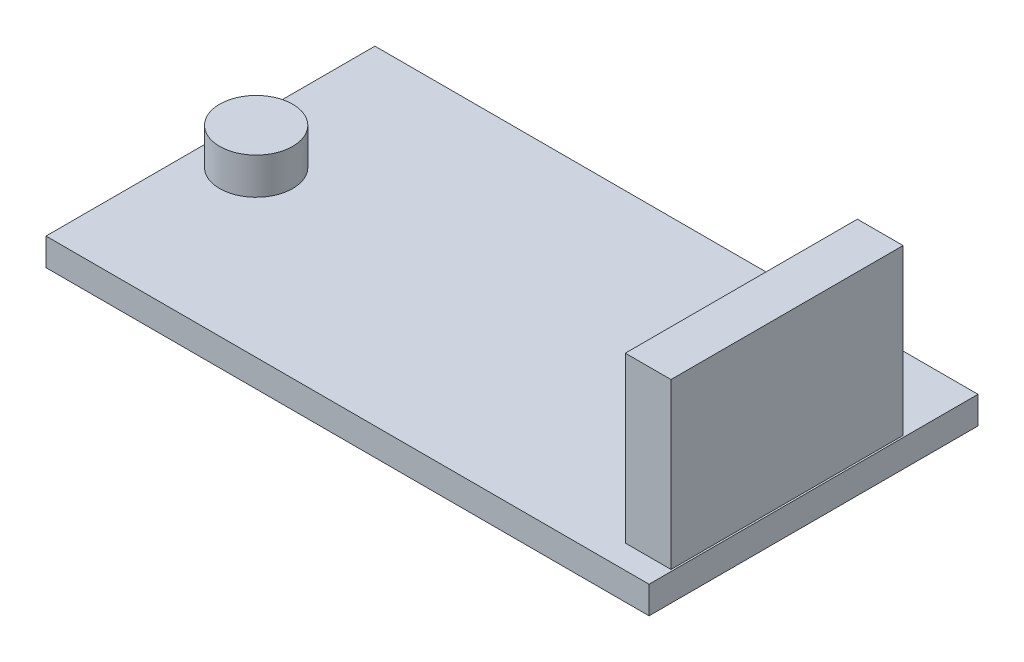
ISO-10303-21;
HEADER;
FILE_DESCRIPTION(('STEP AP214'),'2;1');
FILE_NAME('part.step','',(''),(''),'','','');
FILE_SCHEMA(('AUTOMOTIVE_DESIGN { 1 0 10303 214 1 1 1 1 }'));
ENDSEC;
DATA;
#1=APPLICATION_CONTEXT('core data for automotive mechanical design processes');
#2=APPLICATION_PROTOCOL_DEFINITION('international standard','automotive_design',2000,#1);
#3=PRODUCT_CONTEXT('',#1,'mechanical');
#4=PRODUCT('Part','Part','',(#3));
#5=PRODUCT_RELATED_PRODUCT_CATEGORY('part','',(#4));
#6=PRODUCT_DEFINITION_FORMATION('','',#4);
#7=PRODUCT_DEFINITION_CONTEXT('part definition',#1,'design');
#8=PRODUCT_DEFINITION('design','',#6,#7);
#9=PRODUCT_DEFINITION_SHAPE('','',#8);
#10=(LENGTH_UNIT() NAMED_UNIT(*) SI_UNIT(.MILLI.,.METRE.));
#11=(NAMED_UNIT(*) PLANE_ANGLE_UNIT() SI_UNIT($,.RADIAN.));
#12=(NAMED_UNIT(*) SI_UNIT($,.STERADIAN.) SOLID_ANGLE_UNIT());
#13=UNCERTAINTY_MEASURE_WITH_UNIT(LENGTH_MEASURE(1.E-05),#10,'distance_accuracy_value','');
#14=(GEOMETRIC_REPRESENTATION_CONTEXT(3) GLOBAL_UNCERTAINTY_ASSIGNED_CONTEXT((#13)) GLOBAL_UNIT_ASSIGNED_CONTEXT((#10,
#11,#12)) REPRESENTATION_CONTEXT('',''));
#15=CARTESIAN_POINT('',(0.,0.,0.));
#16=DIRECTION('',(0.,0.,1.));
#17=DIRECTION('',(1.,0.,0.));
#18=AXIS2_PLACEMENT_3D('',#15,#16,#17);
#19=CARTESIAN_POINT('',(0.,1.5,0.));
#20=DIRECTION('',(0.,1.,0.));
#21=DIRECTION('',(0.,0.,1.));
#22=AXIS2_PLACEMENT_3D('',#19,#20,#21);
#23=PLANE('',#22);
#24=CARTESIAN_POINT('',(-14.,1.5,0.));
#25=DIRECTION('',(0.,1.,0.));
#26=DIRECTION('',(0.,0.,1.));
#27=AXIS2_PLACEMENT_3D('',#24,#25,#26);
#28=CIRCLE('',#27,2.);
#29=CARTESIAN_POINT('',(-14.,1.5,2.));
#30=VERTEX_POINT('',#29);
#31=EDGE_CURVE('E209',#30,#30,#28,.T.);
#32=ORIENTED_EDGE('',*,*,#31,.F.);
#33=EDGE_LOOP('',(#32));
#34=FACE_BOUND('',#33,.T.);
#35=DIRECTION('',(0.,0.,-1.));
#36=VECTOR('',#35,1.);
#37=CARTESIAN_POINT('',(16.5,1.5,-9.));
#38=LINE('',#37,#36);
#39=CARTESIAN_POINT('',(16.5,1.5,9.));
#40=VERTEX_POINT('',#39);
#41=CARTESIAN_POINT('',(16.5,1.5,-9.));
#42=VERTEX_POINT('',#41);
#43=EDGE_CURVE('E141',#40,#42,#38,.T.);
#44=ORIENTED_EDGE('',*,*,#43,.T.);
#45=DIRECTION('',(-1.,0.,0.));
#46=VECTOR('',#45,1.);
#47=CARTESIAN_POINT('',(-16.5,1.5,-9.));
#48=LINE('',#47,#46);
#49=CARTESIAN_POINT('',(-16.5,1.5,-9.));
#50=VERTEX_POINT('',#49);
#51=EDGE_CURVE('E86',#42,#50,#48,.T.);
#52=ORIENTED_EDGE('',*,*,#51,.T.);
#53=DIRECTION('',(0.,0.,1.));
#54=VECTOR('',#53,1.);
#55=CARTESIAN_POINT('',(-16.5,1.5,-9.));
#56=LINE('',#55,#54);
#57=CARTESIAN_POINT('',(-16.5,1.5,9.));
#58=VERTEX_POINT('',#57);
#59=EDGE_CURVE('E144',#50,#58,#56,.T.);
#60=ORIENTED_EDGE('',*,*,#59,.T.);
#61=DIRECTION('',(1.,0.,0.));
#62=VECTOR('',#61,1.);
#63=CARTESIAN_POINT('',(-16.5,1.5,9.));
#64=LINE('',#63,#62);
#65=EDGE_CURVE('E58',#58,#40,#64,.T.);
#66=ORIENTED_EDGE('',*,*,#65,.T.);
#67=EDGE_LOOP('',(#44,#52,#60,#66));
#68=FACE_BOUND('',#67,.T.);
#69=DIRECTION('',(-1.,0.,0.));
#70=VECTOR('',#69,1.);
#71=CARTESIAN_POINT('',(16.4,1.5,-5.));
#72=LINE('',#71,#70);
#73=CARTESIAN_POINT('',(16.4,1.5,-5.));
#74=VERTEX_POINT('',#73);
#75=CARTESIAN_POINT('',(13.9,1.5,-5.));
#76=VERTEX_POINT('',#75);
#77=EDGE_CURVE('E211',#74,#76,#72,.T.);
#78=ORIENTED_EDGE('',*,*,#77,.F.);
#79=DIRECTION('',(0.,0.,-1.));
#80=VECTOR('',#79,1.);
#81=CARTESIAN_POINT('',(16.4,1.5,7.7));
#82=LINE('',#81,#80);
#83=CARTESIAN_POINT('',(16.4,1.5,7.7));
#84=VERTEX_POINT('',#83);
#85=EDGE_CURVE('E131',#84,#74,#82,.T.);
#86=ORIENTED_EDGE('',*,*,#85,.F.);
#87=DIRECTION('',(1.,0.,0.));
#88=VECTOR('',#87,1.);
#89=CARTESIAN_POINT('',(16.4,1.5,7.7));
#90=LINE('',#89,#88);
#91=CARTESIAN_POINT('',(13.9,1.5,7.7));
#92=VERTEX_POINT('',#91);
#93=EDGE_CURVE('E127',#92,#84,#90,.T.);
#94=ORIENTED_EDGE('',*,*,#93,.F.);
#95=DIRECTION('',(0.,0.,1.));
#96=VECTOR('',#95,1.);
#97=CARTESIAN_POINT('',(13.9,1.5,7.7));
#98=LINE('',#97,#96);
#99=EDGE_CURVE('E220',#76,#92,#98,.T.);
#100=ORIENTED_EDGE('',*,*,#99,.F.);
#101=EDGE_LOOP('',(#78,#86,#94,#100));
#102=FACE_BOUND('',#101,.T.);
#103=ADVANCED_FACE('F34',(#34,#68,#102),#23,.T.);
#104=CARTESIAN_POINT('',(16.5,1.5,-9.));
#105=DIRECTION('',(-1.,0.,0.));
#106=DIRECTION('',(0.,0.,1.));
#107=AXIS2_PLACEMENT_3D('',#104,#105,#106);
#108=PLANE('',#107);
#109=DIRECTION('',(0.,0.,-1.));
#110=VECTOR('',#109,1.);
#111=CARTESIAN_POINT('',(16.5,0.,-9.));
#112=LINE('',#111,#110);
#113=CARTESIAN_POINT('',(16.5,0.,9.));
#114=VERTEX_POINT('',#113);
#115=CARTESIAN_POINT('',(16.5,0.,-9.));
#116=VERTEX_POINT('',#115);
#117=EDGE_CURVE('E133',#114,#116,#112,.T.);
#118=ORIENTED_EDGE('',*,*,#117,.T.);
#119=DIRECTION('',(0.,-1.,0.));
#120=VECTOR('',#119,1.);
#121=CARTESIAN_POINT('',(16.5,1.5,-9.));
#122=LINE('',#121,#120);
#123=EDGE_CURVE('E11',#42,#116,#122,.T.);
#124=ORIENTED_EDGE('',*,*,#123,.F.);
#125=ORIENTED_EDGE('',*,*,#43,.F.);
#126=DIRECTION('',(0.,-1.,0.));
#127=VECTOR('',#126,1.);
#128=CARTESIAN_POINT('',(16.5,1.5,9.));
#129=LINE('',#128,#127);
#130=EDGE_CURVE('E146',#40,#114,#129,.T.);
#131=ORIENTED_EDGE('',*,*,#130,.T.);
#132=EDGE_LOOP('',(#118,#124,#125,#131));
#133=FACE_BOUND('',#132,.T.);
#134=ADVANCED_FACE('F36',(#133),#108,.F.);
#135=CARTESIAN_POINT('',(-16.5,1.5,-9.));
#136=DIRECTION('',(0.,0.,1.));
#137=DIRECTION('',(1.,0.,0.));
#138=AXIS2_PLACEMENT_3D('',#135,#136,#137);
#139=PLANE('',#138);
#140=DIRECTION('',(-1.,0.,0.));
#141=VECTOR('',#140,1.);
#142=CARTESIAN_POINT('',(-16.5,0.,-9.));
#143=LINE('',#142,#141);
#144=CARTESIAN_POINT('',(-16.5,0.,-9.));
#145=VERTEX_POINT('',#144);
#146=EDGE_CURVE('E136',#116,#145,#143,.T.);
#147=ORIENTED_EDGE('',*,*,#146,.T.);
#148=DIRECTION('',(0.,-1.,0.));
#149=VECTOR('',#148,1.);
#150=CARTESIAN_POINT('',(-16.5,1.5,-9.));
#151=LINE('',#150,#149);
#152=EDGE_CURVE('E42',#50,#145,#151,.T.);
#153=ORIENTED_EDGE('',*,*,#152,.F.);
#154=ORIENTED_EDGE('',*,*,#51,.F.);
#155=ORIENTED_EDGE('',*,*,#123,.T.);
#156=EDGE_LOOP('',(#147,#153,#154,#155));
#157=FACE_BOUND('',#156,.T.);
#158=ADVANCED_FACE('F174',(#157),#139,.F.);
#159=CARTESIAN_POINT('',(-16.5,1.5,-9.));
#160=DIRECTION('',(1.,0.,0.));
#161=DIRECTION('',(0.,0.,-1.));
#162=AXIS2_PLACEMENT_3D('',#159,#160,#161);
#163=PLANE('',#162);
#164=DIRECTION('',(0.,0.,1.));
#165=VECTOR('',#164,1.);
#166=CARTESIAN_POINT('',(-16.5,0.,-9.));
#167=LINE('',#166,#165);
#168=CARTESIAN_POINT('',(-16.5,0.,9.));
#169=VERTEX_POINT('',#168);
#170=EDGE_CURVE('E149',#145,#169,#167,.T.);
#171=ORIENTED_EDGE('',*,*,#170,.T.);
#172=DIRECTION('',(0.,-1.,0.));
#173=VECTOR('',#172,1.);
#174=CARTESIAN_POINT('',(-16.5,1.5,9.));
#175=LINE('',#174,#173);
#176=EDGE_CURVE('E153',#58,#169,#175,.T.);
#177=ORIENTED_EDGE('',*,*,#176,.F.);
#178=ORIENTED_EDGE('',*,*,#59,.F.);
#179=ORIENTED_EDGE('',*,*,#152,.T.);
#180=EDGE_LOOP('',(#171,#177,#178,#179));
#181=FACE_BOUND('',#180,.T.);
#182=ADVANCED_FACE('F158',(#181),#163,.F.);
#183=CARTESIAN_POINT('',(-16.5,1.5,9.));
#184=DIRECTION('',(0.,0.,-1.));
#185=DIRECTION('',(-1.,0.,0.));
#186=AXIS2_PLACEMENT_3D('',#183,#184,#185);
#187=PLANE('',#186);
#188=DIRECTION('',(1.,0.,0.));
#189=VECTOR('',#188,1.);
#190=CARTESIAN_POINT('',(-16.5,0.,9.));
#191=LINE('',#190,#189);
#192=EDGE_CURVE('E79',#169,#114,#191,.T.);
#193=ORIENTED_EDGE('',*,*,#192,.T.);
#194=ORIENTED_EDGE('',*,*,#130,.F.);
#195=ORIENTED_EDGE('',*,*,#65,.F.);
#196=ORIENTED_EDGE('',*,*,#176,.T.);
#197=EDGE_LOOP('',(#193,#194,#195,#196));
#198=FACE_BOUND('',#197,.T.);
#199=ADVANCED_FACE('F166',(#198),#187,.F.);
#200=CARTESIAN_POINT('',(0.,0.,0.));
#201=DIRECTION('',(0.,1.,0.));
#202=DIRECTION('',(0.,0.,1.));
#203=AXIS2_PLACEMENT_3D('',#200,#201,#202);
#204=PLANE('',#203);
#205=ORIENTED_EDGE('',*,*,#117,.F.);
#206=ORIENTED_EDGE('',*,*,#192,.F.);
#207=ORIENTED_EDGE('',*,*,#170,.F.);
#208=ORIENTED_EDGE('',*,*,#146,.F.);
#209=EDGE_LOOP('',(#205,#206,#207,#208));
#210=FACE_BOUND('',#209,.T.);
#211=ADVANCED_FACE('F162',(#210),#204,.F.);
#212=CARTESIAN_POINT('',(16.4,10.5,7.7));
#213=DIRECTION('',(-1.,0.,0.));
#214=DIRECTION('',(0.,0.,1.));
#215=AXIS2_PLACEMENT_3D('',#212,#213,#214);
#216=PLANE('',#215);
#217=ORIENTED_EDGE('',*,*,#85,.T.);
#218=DIRECTION('',(0.,-1.,0.));
#219=VECTOR('',#218,1.);
#220=CARTESIAN_POINT('',(16.4,10.5,-5.));
#221=LINE('',#220,#219);
#222=CARTESIAN_POINT('',(16.4,10.5,-5.));
#223=VERTEX_POINT('',#222);
#224=EDGE_CURVE('E112',#223,#74,#221,.T.);
#225=ORIENTED_EDGE('',*,*,#224,.F.);
#226=DIRECTION('',(0.,0.,-1.));
#227=VECTOR('',#226,1.);
#228=CARTESIAN_POINT('',(16.4,10.5,7.7));
#229=LINE('',#228,#227);
#230=CARTESIAN_POINT('',(16.4,10.5,7.7));
#231=VERTEX_POINT('',#230);
#232=EDGE_CURVE('E119',#231,#223,#229,.T.);
#233=ORIENTED_EDGE('',*,*,#232,.F.);
#234=DIRECTION('',(0.,-1.,0.));
#235=VECTOR('',#234,1.);
#236=CARTESIAN_POINT('',(16.4,10.5,7.7));
#237=LINE('',#236,#235);
#238=EDGE_CURVE('E217',#231,#84,#237,.T.);
#239=ORIENTED_EDGE('',*,*,#238,.T.);
#240=EDGE_LOOP('',(#217,#225,#233,#239));
#241=FACE_BOUND('',#240,.T.);
#242=ADVANCED_FACE('F129',(#241),#216,.F.);
#243=CARTESIAN_POINT('',(16.4,10.5,-5.));
#244=DIRECTION('',(0.,0.,1.));
#245=DIRECTION('',(1.,0.,0.));
#246=AXIS2_PLACEMENT_3D('',#243,#244,#245);
#247=PLANE('',#246);
#248=ORIENTED_EDGE('',*,*,#77,.T.);
#249=DIRECTION('',(0.,-1.,0.));
#250=VECTOR('',#249,1.);
#251=CARTESIAN_POINT('',(13.9,10.5,-5.));
#252=LINE('',#251,#250);
#253=CARTESIAN_POINT('',(13.9,10.5,-5.));
#254=VERTEX_POINT('',#253);
#255=EDGE_CURVE('E115',#254,#76,#252,.T.);
#256=ORIENTED_EDGE('',*,*,#255,.F.);
#257=DIRECTION('',(-1.,0.,0.));
#258=VECTOR('',#257,1.);
#259=CARTESIAN_POINT('',(16.4,10.5,-5.));
#260=LINE('',#259,#258);
#261=EDGE_CURVE('E108',#223,#254,#260,.T.);
#262=ORIENTED_EDGE('',*,*,#261,.F.);
#263=ORIENTED_EDGE('',*,*,#224,.T.);
#264=EDGE_LOOP('',(#248,#256,#262,#263));
#265=FACE_BOUND('',#264,.T.);
#266=ADVANCED_FACE('F110',(#265),#247,.F.);
#267=CARTESIAN_POINT('',(13.9,10.5,7.7));
#268=DIRECTION('',(1.,0.,0.));
#269=DIRECTION('',(0.,0.,-1.));
#270=AXIS2_PLACEMENT_3D('',#267,#268,#269);
#271=PLANE('',#270);
#272=ORIENTED_EDGE('',*,*,#99,.T.);
#273=DIRECTION('',(0.,-1.,0.));
#274=VECTOR('',#273,1.);
#275=CARTESIAN_POINT('',(13.9,10.5,7.7));
#276=LINE('',#275,#274);
#277=CARTESIAN_POINT('',(13.9,10.5,7.7));
#278=VERTEX_POINT('',#277);
#279=EDGE_CURVE('E49',#278,#92,#276,.T.);
#280=ORIENTED_EDGE('',*,*,#279,.F.);
#281=DIRECTION('',(0.,0.,1.));
#282=VECTOR('',#281,1.);
#283=CARTESIAN_POINT('',(13.9,10.5,7.7));
#284=LINE('',#283,#282);
#285=EDGE_CURVE('E118',#254,#278,#284,.T.);
#286=ORIENTED_EDGE('',*,*,#285,.F.);
#287=ORIENTED_EDGE('',*,*,#255,.T.);
#288=EDGE_LOOP('',(#272,#280,#286,#287));
#289=FACE_BOUND('',#288,.T.);
#290=ADVANCED_FACE('F188',(#289),#271,.F.);
#291=CARTESIAN_POINT('',(16.4,10.5,7.7));
#292=DIRECTION('',(0.,0.,-1.));
#293=DIRECTION('',(-1.,0.,0.));
#294=AXIS2_PLACEMENT_3D('',#291,#292,#293);
#295=PLANE('',#294);
#296=ORIENTED_EDGE('',*,*,#93,.T.);
#297=ORIENTED_EDGE('',*,*,#238,.F.);
#298=DIRECTION('',(1.,0.,0.));
#299=VECTOR('',#298,1.);
#300=CARTESIAN_POINT('',(16.4,10.5,7.7));
#301=LINE('',#300,#299);
#302=EDGE_CURVE('E123',#278,#231,#301,.T.);
#303=ORIENTED_EDGE('',*,*,#302,.F.);
#304=ORIENTED_EDGE('',*,*,#279,.T.);
#305=EDGE_LOOP('',(#296,#297,#303,#304));
#306=FACE_BOUND('',#305,.T.);
#307=ADVANCED_FACE('F191',(#306),#295,.F.);
#308=CARTESIAN_POINT('',(0.,10.5,0.));
#309=DIRECTION('',(0.,1.,0.));
#310=DIRECTION('',(0.,0.,1.));
#311=AXIS2_PLACEMENT_3D('',#308,#309,#310);
#312=PLANE('',#311);
#313=ORIENTED_EDGE('',*,*,#232,.T.);
#314=ORIENTED_EDGE('',*,*,#261,.T.);
#315=ORIENTED_EDGE('',*,*,#285,.T.);
#316=ORIENTED_EDGE('',*,*,#302,.T.);
#317=EDGE_LOOP('',(#313,#314,#315,#316));
#318=FACE_BOUND('',#317,.T.);
#319=ADVANCED_FACE('F122',(#318),#312,.T.);
#320=CARTESIAN_POINT('',(-14.,3.5,0.));
#321=DIRECTION('',(0.,-1.,0.));
#322=DIRECTION('',(0.,0.,-1.));
#323=AXIS2_PLACEMENT_3D('',#320,#321,#322);
#324=CYLINDRICAL_SURFACE('',#323,2.);
#325=CARTESIAN_POINT('',(-14.,3.5,0.));
#326=DIRECTION('',(0.,1.,0.));
#327=DIRECTION('',(0.,0.,1.));
#328=AXIS2_PLACEMENT_3D('',#325,#326,#327);
#329=CIRCLE('',#328,2.);
#330=CARTESIAN_POINT('',(-14.,3.5,2.));
#331=VERTEX_POINT('',#330);
#332=EDGE_CURVE('E208',#331,#331,#329,.T.);
#333=ORIENTED_EDGE('',*,*,#332,.F.);
#334=EDGE_LOOP('',(#333));
#335=FACE_BOUND('',#334,.T.);
#336=ORIENTED_EDGE('',*,*,#31,.T.);
#337=EDGE_LOOP('',(#336));
#338=FACE_BOUND('',#337,.T.);
#339=ADVANCED_FACE('F197',(#335,#338),#324,.T.);
#340=CARTESIAN_POINT('',(-14.,3.5,0.));
#341=DIRECTION('',(0.,1.,0.));
#342=DIRECTION('',(0.,0.,1.));
#343=AXIS2_PLACEMENT_3D('',#340,#341,#342);
#344=PLANE('',#343);
#345=ORIENTED_EDGE('',*,*,#332,.T.);
#346=EDGE_LOOP('',(#345));
#347=FACE_BOUND('',#346,.T.);
#348=ADVANCED_FACE('F200',(#347),#344,.T.);
#349=CLOSED_SHELL('',(#103,#134,#158,#182,#199,#211,#242,#266,#290,#307,#319,#339,#348));
#350=MANIFOLD_SOLID_BREP('B2',#349);
#351=ADVANCED_BREP_SHAPE_REPRESENTATION('',(#18,#350),#14);
#352=SHAPE_DEFINITION_REPRESENTATION(#9,#351);
ENDSEC;
END-ISO-10303-21;
